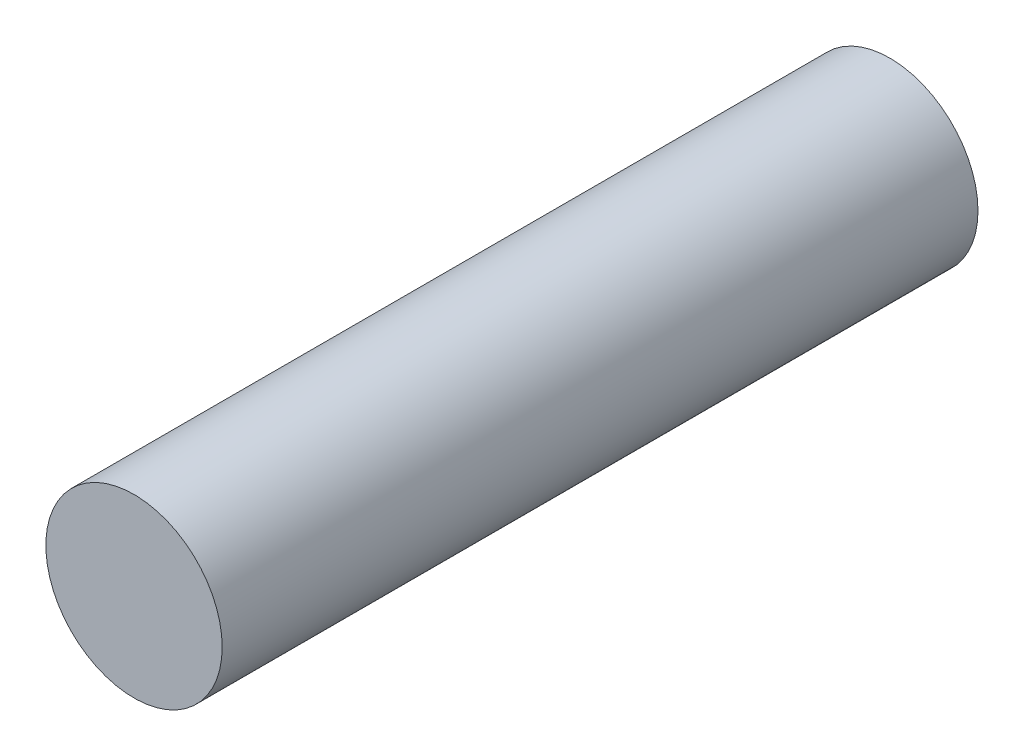
ISO-10303-21;
HEADER;
FILE_DESCRIPTION(('STEP AP214'),'2;1');
FILE_NAME('part.step','',(''),(''),'','','');
FILE_SCHEMA(('AUTOMOTIVE_DESIGN { 1 0 10303 214 1 1 1 1 }'));
ENDSEC;
DATA;
#1=APPLICATION_CONTEXT('core data for automotive mechanical design processes');
#2=APPLICATION_PROTOCOL_DEFINITION('international standard','automotive_design',2000,#1);
#3=PRODUCT_CONTEXT('',#1,'mechanical');
#4=PRODUCT('Part','Part','',(#3));
#5=PRODUCT_RELATED_PRODUCT_CATEGORY('part','',(#4));
#6=PRODUCT_DEFINITION_FORMATION('','',#4);
#7=PRODUCT_DEFINITION_CONTEXT('part definition',#1,'design');
#8=PRODUCT_DEFINITION('design','',#6,#7);
#9=PRODUCT_DEFINITION_SHAPE('','',#8);
#10=(LENGTH_UNIT() NAMED_UNIT(*) SI_UNIT(.MILLI.,.METRE.));
#11=(NAMED_UNIT(*) PLANE_ANGLE_UNIT() SI_UNIT($,.RADIAN.));
#12=(NAMED_UNIT(*) SI_UNIT($,.STERADIAN.) SOLID_ANGLE_UNIT());
#13=UNCERTAINTY_MEASURE_WITH_UNIT(LENGTH_MEASURE(1.E-05),#10,'distance_accuracy_value','');
#14=(GEOMETRIC_REPRESENTATION_CONTEXT(3) GLOBAL_UNCERTAINTY_ASSIGNED_CONTEXT((#13)) GLOBAL_UNIT_ASSIGNED_CONTEXT((#10,
#11,#12)) REPRESENTATION_CONTEXT('',''));
#15=CARTESIAN_POINT('',(0.,0.,0.));
#16=DIRECTION('',(0.,0.,1.));
#17=DIRECTION('',(1.,0.,0.));
#18=AXIS2_PLACEMENT_3D('',#15,#16,#17);
#19=CARTESIAN_POINT('',(0.,0.,30.));
#20=DIRECTION('',(0.,0.,-1.));
#21=DIRECTION('',(-1.,0.,0.));
#22=AXIS2_PLACEMENT_3D('',#19,#20,#21);
#23=CYLINDRICAL_SURFACE('',#22,3.5);
#24=CARTESIAN_POINT('',(0.,0.,30.));
#25=DIRECTION('',(0.,0.,1.));
#26=DIRECTION('',(1.,0.,0.));
#27=AXIS2_PLACEMENT_3D('',#24,#25,#26);
#28=CIRCLE('',#27,3.5);
#29=CARTESIAN_POINT('',(3.5,0.,30.));
#30=VERTEX_POINT('',#29);
#31=EDGE_CURVE('E10',#30,#30,#28,.T.);
#32=ORIENTED_EDGE('',*,*,#31,.F.);
#33=EDGE_LOOP('',(#32));
#34=FACE_BOUND('',#33,.T.);
#35=CARTESIAN_POINT('',(0.,0.,0.));
#36=DIRECTION('',(0.,0.,1.));
#37=DIRECTION('',(1.,0.,0.));
#38=AXIS2_PLACEMENT_3D('',#35,#36,#37);
#39=CIRCLE('',#38,3.5);
#40=CARTESIAN_POINT('',(3.5,0.,0.));
#41=VERTEX_POINT('',#40);
#42=EDGE_CURVE('E36',#41,#41,#39,.T.);
#43=ORIENTED_EDGE('',*,*,#42,.T.);
#44=EDGE_LOOP('',(#43));
#45=FACE_BOUND('',#44,.T.);
#46=ADVANCED_FACE('F33',(#34,#45),#23,.T.);
#47=CARTESIAN_POINT('',(0.,0.,30.));
#48=DIRECTION('',(0.,0.,1.));
#49=DIRECTION('',(1.,0.,0.));
#50=AXIS2_PLACEMENT_3D('',#47,#48,#49);
#51=PLANE('',#50);
#52=ORIENTED_EDGE('',*,*,#31,.T.);
#53=EDGE_LOOP('',(#52));
#54=FACE_BOUND('',#53,.T.);
#55=ADVANCED_FACE('F48',(#54),#51,.T.);
#56=CARTESIAN_POINT('',(0.,0.,0.));
#57=DIRECTION('',(0.,0.,1.));
#58=DIRECTION('',(1.,0.,0.));
#59=AXIS2_PLACEMENT_3D('',#56,#57,#58);
#60=PLANE('',#59);
#61=ORIENTED_EDGE('',*,*,#42,.F.);
#62=EDGE_LOOP('',(#61));
#63=FACE_BOUND('',#62,.T.);
#64=ADVANCED_FACE('F46',(#63),#60,.F.);
#65=CLOSED_SHELL('',(#46,#55,#64));
#66=MANIFOLD_SOLID_BREP('B2',#65);
#67=ADVANCED_BREP_SHAPE_REPRESENTATION('',(#18,#66),#14);
#68=SHAPE_DEFINITION_REPRESENTATION(#9,#67);
ENDSEC;
END-ISO-10303-21;
